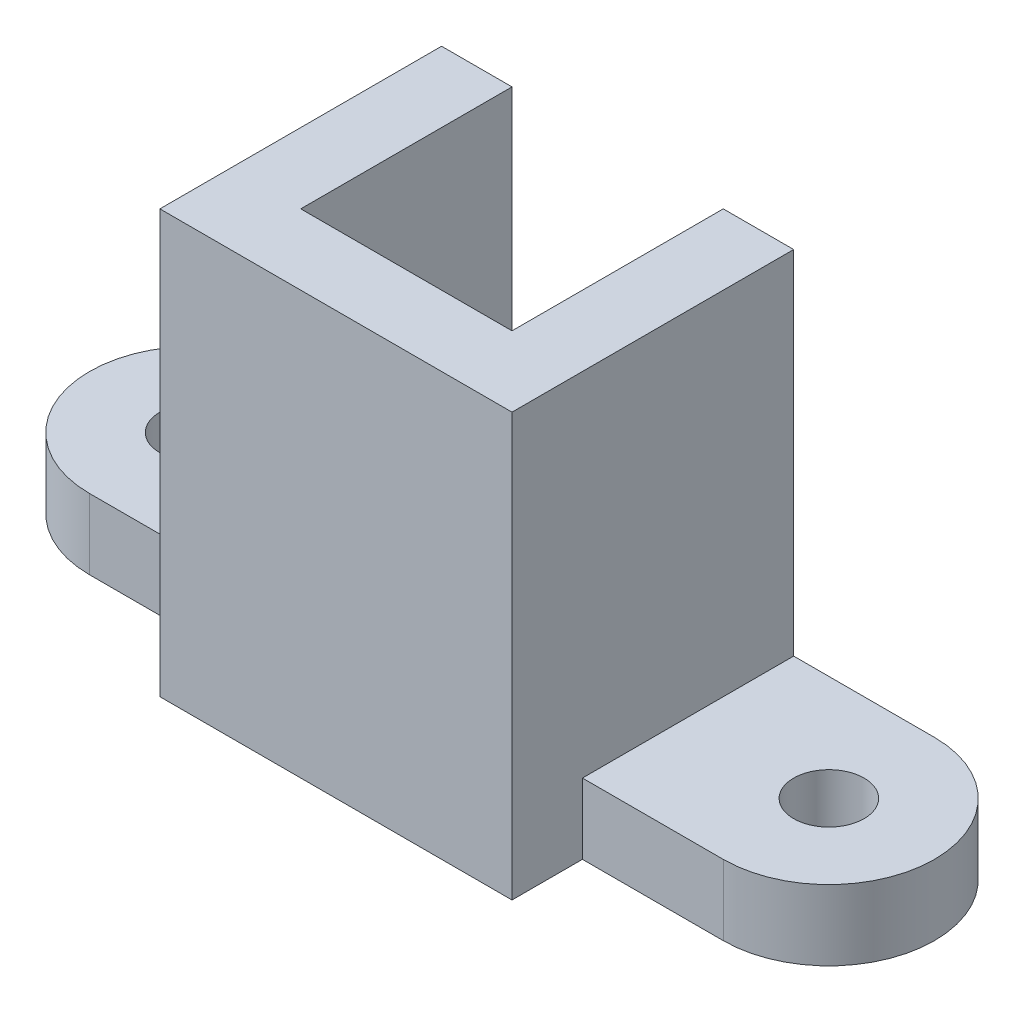
ISO-10303-21;
HEADER;
FILE_DESCRIPTION(('STEP AP214'),'2;1');
FILE_NAME('part.step','',(''),(''),'','','');
FILE_SCHEMA(('AUTOMOTIVE_DESIGN { 1 0 10303 214 1 1 1 1 }'));
ENDSEC;
DATA;
#1=APPLICATION_CONTEXT('core data for automotive mechanical design processes');
#2=APPLICATION_PROTOCOL_DEFINITION('international standard','automotive_design',2000,#1);
#3=PRODUCT_CONTEXT('',#1,'mechanical');
#4=PRODUCT('Part','Part','',(#3));
#5=PRODUCT_RELATED_PRODUCT_CATEGORY('part','',(#4));
#6=PRODUCT_DEFINITION_FORMATION('','',#4);
#7=PRODUCT_DEFINITION_CONTEXT('part definition',#1,'design');
#8=PRODUCT_DEFINITION('design','',#6,#7);
#9=PRODUCT_DEFINITION_SHAPE('','',#8);
#10=(LENGTH_UNIT() NAMED_UNIT(*) SI_UNIT(.MILLI.,.METRE.));
#11=(NAMED_UNIT(*) PLANE_ANGLE_UNIT() SI_UNIT($,.RADIAN.));
#12=(NAMED_UNIT(*) SI_UNIT($,.STERADIAN.) SOLID_ANGLE_UNIT());
#13=UNCERTAINTY_MEASURE_WITH_UNIT(LENGTH_MEASURE(1.E-05),#10,'distance_accuracy_value','');
#14=(GEOMETRIC_REPRESENTATION_CONTEXT(3) GLOBAL_UNCERTAINTY_ASSIGNED_CONTEXT((#13)) GLOBAL_UNIT_ASSIGNED_CONTEXT((#10,
#11,#12)) REPRESENTATION_CONTEXT('',''));
#15=CARTESIAN_POINT('',(0.,0.,0.));
#16=DIRECTION('',(0.,0.,1.));
#17=DIRECTION('',(1.,0.,0.));
#18=AXIS2_PLACEMENT_3D('',#15,#16,#17);
#19=CARTESIAN_POINT('',(60.0000000000005,60.,14.9999999999997));
#20=DIRECTION('',(-1.,0.,0.));
#21=DIRECTION('',(0.,0.,1.));
#22=AXIS2_PLACEMENT_3D('',#19,#20,#21);
#23=PLANE('',#22);
#24=DIRECTION('',(0.,-1.,0.));
#25=VECTOR('',#24,1.);
#26=CARTESIAN_POINT('',(60.0000000000005,60.,-14.9999999999997));
#27=LINE('',#26,#25);
#28=CARTESIAN_POINT('',(60.0000000000005,60.,-14.9999999999997));
#29=VERTEX_POINT('',#28);
#30=CARTESIAN_POINT('',(60.0000000000005,10.,-14.9999999999997));
#31=VERTEX_POINT('',#30);
#32=EDGE_CURVE('E144',#29,#31,#27,.T.);
#33=ORIENTED_EDGE('',*,*,#32,.T.);
#34=DIRECTION('',(0.,-0.857492925712548,-0.51449575542752));
#35=VECTOR('',#34,1.);
#36=CARTESIAN_POINT('',(60.0000000000005,10.,-14.9999999999997));
#37=LINE('',#36,#35);
#38=CARTESIAN_POINT('',(60.0000000000005,60.,14.9999999999997));
#39=VERTEX_POINT('',#38);
#40=EDGE_CURVE('E143',#39,#31,#37,.T.);
#41=ORIENTED_EDGE('',*,*,#40,.F.);
#42=DIRECTION('',(0.,0.,-1.));
#43=VECTOR('',#42,1.);
#44=CARTESIAN_POINT('',(60.0000000000005,60.,14.9999999999997));
#45=LINE('',#44,#43);
#46=EDGE_CURVE('E129',#39,#29,#45,.T.);
#47=ORIENTED_EDGE('',*,*,#46,.T.);
#48=EDGE_LOOP('',(#33,#41,#47));
#49=FACE_BOUND('',#48,.T.);
#50=ADVANCED_FACE('F33',(#49),#23,.T.);
#51=CARTESIAN_POINT('',(30.0000000000005,60.,14.9999999999997));
#52=DIRECTION('',(1.,0.,0.));
#53=DIRECTION('',(0.,0.,-1.));
#54=AXIS2_PLACEMENT_3D('',#51,#52,#53);
#55=PLANE('',#54);
#56=DIRECTION('',(0.,0.,1.));
#57=VECTOR('',#56,1.);
#58=CARTESIAN_POINT('',(30.0000000000005,60.,14.9999999999997));
#59=LINE('',#58,#57);
#60=CARTESIAN_POINT('',(30.0000000000005,60.,-14.9999999999997));
#61=VERTEX_POINT('',#60);
#62=CARTESIAN_POINT('',(30.0000000000005,60.,14.9999999999997));
#63=VERTEX_POINT('',#62);
#64=EDGE_CURVE('E149',#61,#63,#59,.T.);
#65=ORIENTED_EDGE('',*,*,#64,.T.);
#66=DIRECTION('',(0.,-0.857492925712548,-0.51449575542752));
#67=VECTOR('',#66,1.);
#68=CARTESIAN_POINT('',(30.0000000000005,10.,-14.9999999999997));
#69=LINE('',#68,#67);
#70=CARTESIAN_POINT('',(30.0000000000005,10.,-14.9999999999997));
#71=VERTEX_POINT('',#70);
#72=EDGE_CURVE('E56',#63,#71,#69,.T.);
#73=ORIENTED_EDGE('',*,*,#72,.T.);
#74=DIRECTION('',(0.,-1.,0.));
#75=VECTOR('',#74,1.);
#76=CARTESIAN_POINT('',(30.0000000000005,60.,-14.9999999999997));
#77=LINE('',#76,#75);
#78=EDGE_CURVE('E165',#61,#71,#77,.T.);
#79=ORIENTED_EDGE('',*,*,#78,.F.);
#80=EDGE_LOOP('',(#65,#73,#79));
#81=FACE_BOUND('',#80,.T.);
#82=ADVANCED_FACE('F297',(#81),#55,.T.);
#83=CARTESIAN_POINT('',(90.0000000000003,10.,0.));
#84=DIRECTION('',(0.,1.,0.));
#85=DIRECTION('',(0.,0.,1.));
#86=AXIS2_PLACEMENT_3D('',#83,#84,#85);
#87=PLANE('',#86);
#88=DIRECTION('',(0.,0.,-1.));
#89=VECTOR('',#88,1.);
#90=CARTESIAN_POINT('',(70.0000000000005,10.,0.));
#91=LINE('',#90,#89);
#92=CARTESIAN_POINT('',(70.0000000000005,10.,14.9999999999997));
#93=VERTEX_POINT('',#92);
#94=CARTESIAN_POINT('',(70.0000000000005,10.,-14.9999999999997));
#95=VERTEX_POINT('',#94);
#96=EDGE_CURVE('E163',#93,#95,#91,.T.);
#97=ORIENTED_EDGE('',*,*,#96,.F.);
#98=DIRECTION('',(1.,0.,0.));
#99=VECTOR('',#98,1.);
#100=CARTESIAN_POINT('',(70.0000000000005,10.,14.9999999999997));
#101=LINE('',#100,#99);
#102=CARTESIAN_POINT('',(90.0000000000003,10.,14.9999999999997));
#103=VERTEX_POINT('',#102);
#104=EDGE_CURVE('E197',#93,#103,#101,.T.);
#105=ORIENTED_EDGE('',*,*,#104,.T.);
#106=CARTESIAN_POINT('',(90.0000000000003,10.,0.));
#107=DIRECTION('',(0.,1.,0.));
#108=DIRECTION('',(0.,0.,1.));
#109=AXIS2_PLACEMENT_3D('',#106,#107,#108);
#110=CIRCLE('',#109,14.9999999999997);
#111=CARTESIAN_POINT('',(90.0000000000003,10.,-14.9999999999997));
#112=VERTEX_POINT('',#111);
#113=EDGE_CURVE('E185',#103,#112,#110,.T.);
#114=ORIENTED_EDGE('',*,*,#113,.T.);
#115=DIRECTION('',(-1.,0.,0.));
#116=VECTOR('',#115,1.);
#117=CARTESIAN_POINT('',(90.0000000000003,10.,-14.9999999999997));
#118=LINE('',#117,#116);
#119=EDGE_CURVE('E190',#112,#95,#118,.T.);
#120=ORIENTED_EDGE('',*,*,#119,.T.);
#121=EDGE_LOOP('',(#97,#105,#114,#120));
#122=FACE_BOUND('',#121,.T.);
#123=CARTESIAN_POINT('',(90.0000000000003,10.,0.));
#124=DIRECTION('',(0.,1.,0.));
#125=DIRECTION('',(0.,0.,1.));
#126=AXIS2_PLACEMENT_3D('',#123,#124,#125);
#127=CIRCLE('',#126,4.99999999999983);
#128=CARTESIAN_POINT('',(90.0000000000003,10.,4.99999999999983));
#129=VERTEX_POINT('',#128);
#130=EDGE_CURVE('E173',#129,#129,#127,.T.);
#131=ORIENTED_EDGE('',*,*,#130,.F.);
#132=EDGE_LOOP('',(#131));
#133=FACE_BOUND('',#132,.T.);
#134=ADVANCED_FACE('F272',(#122,#133),#87,.T.);
#135=DIRECTION('',(0.,0.,1.));
#136=VECTOR('',#135,1.);
#137=CARTESIAN_POINT('',(20.0000000000005,10.,0.));
#138=LINE('',#137,#136);
#139=CARTESIAN_POINT('',(20.0000000000005,10.,-14.9999999999997));
#140=VERTEX_POINT('',#139);
#141=CARTESIAN_POINT('',(20.0000000000005,10.,14.9999999999997));
#142=VERTEX_POINT('',#141);
#143=EDGE_CURVE('E48',#140,#142,#138,.T.);
#144=ORIENTED_EDGE('',*,*,#143,.F.);
#145=CARTESIAN_POINT('',(0.,10.,-14.9999999999997));
#146=VERTEX_POINT('',#145);
#147=EDGE_CURVE('E188',#140,#146,#118,.T.);
#148=ORIENTED_EDGE('',*,*,#147,.T.);
#149=CARTESIAN_POINT('',(0.,10.,0.));
#150=DIRECTION('',(0.,1.,0.));
#151=DIRECTION('',(0.,0.,1.));
#152=AXIS2_PLACEMENT_3D('',#149,#150,#151);
#153=CIRCLE('',#152,14.9999999999997);
#154=CARTESIAN_POINT('',(0.,10.,14.9999999999997));
#155=VERTEX_POINT('',#154);
#156=EDGE_CURVE('E192',#146,#155,#153,.T.);
#157=ORIENTED_EDGE('',*,*,#156,.T.);
#158=DIRECTION('',(1.,0.,0.));
#159=VECTOR('',#158,1.);
#160=CARTESIAN_POINT('',(0.,10.,14.9999999999997));
#161=LINE('',#160,#159);
#162=EDGE_CURVE('E195',#155,#142,#161,.T.);
#163=ORIENTED_EDGE('',*,*,#162,.T.);
#164=EDGE_LOOP('',(#144,#148,#157,#163));
#165=FACE_BOUND('',#164,.T.);
#166=CARTESIAN_POINT('',(0.,10.,0.));
#167=DIRECTION('',(0.,1.,0.));
#168=DIRECTION('',(0.,0.,1.));
#169=AXIS2_PLACEMENT_3D('',#166,#167,#168);
#170=CIRCLE('',#169,5.);
#171=CARTESIAN_POINT('',(0.,10.,5.));
#172=VERTEX_POINT('',#171);
#173=EDGE_CURVE('E179',#172,#172,#170,.T.);
#174=ORIENTED_EDGE('',*,*,#173,.F.);
#175=EDGE_LOOP('',(#174));
#176=FACE_BOUND('',#175,.T.);
#177=ADVANCED_FACE('F269',(#165,#176),#87,.T.);
#178=CARTESIAN_POINT('',(90.0000000000003,0.,0.));
#179=DIRECTION('',(0.,1.,0.));
#180=DIRECTION('',(0.,0.,1.));
#181=AXIS2_PLACEMENT_3D('',#178,#179,#180);
#182=PLANE('',#181);
#183=CARTESIAN_POINT('',(0.,0.,0.));
#184=DIRECTION('',(0.,1.,0.));
#185=DIRECTION('',(0.,0.,1.));
#186=AXIS2_PLACEMENT_3D('',#183,#184,#185);
#187=CIRCLE('',#186,14.9999999999997);
#188=CARTESIAN_POINT('',(0.,0.,-14.9999999999997));
#189=VERTEX_POINT('',#188);
#190=CARTESIAN_POINT('',(0.,0.,14.9999999999997));
#191=VERTEX_POINT('',#190);
#192=EDGE_CURVE('E204',#189,#191,#187,.T.);
#193=ORIENTED_EDGE('',*,*,#192,.F.);
#194=DIRECTION('',(-1.,0.,0.));
#195=VECTOR('',#194,1.);
#196=CARTESIAN_POINT('',(90.0000000000003,0.,-14.9999999999997));
#197=LINE('',#196,#195);
#198=CARTESIAN_POINT('',(90.0000000000003,0.,-14.9999999999997));
#199=VERTEX_POINT('',#198);
#200=EDGE_CURVE('E202',#199,#189,#197,.T.);
#201=ORIENTED_EDGE('',*,*,#200,.F.);
#202=CARTESIAN_POINT('',(90.0000000000003,0.,0.));
#203=DIRECTION('',(0.,1.,0.));
#204=DIRECTION('',(0.,0.,1.));
#205=AXIS2_PLACEMENT_3D('',#202,#203,#204);
#206=CIRCLE('',#205,14.9999999999997);
#207=CARTESIAN_POINT('',(90.0000000000003,0.,14.9999999999997));
#208=VERTEX_POINT('',#207);
#209=EDGE_CURVE('E182',#208,#199,#206,.T.);
#210=ORIENTED_EDGE('',*,*,#209,.F.);
#211=DIRECTION('',(1.,0.,0.));
#212=VECTOR('',#211,1.);
#213=CARTESIAN_POINT('',(70.0000000000005,0.,14.9999999999997));
#214=LINE('',#213,#212);
#215=CARTESIAN_POINT('',(70.0000000000005,0.,14.9999999999997));
#216=VERTEX_POINT('',#215);
#217=EDGE_CURVE('E189',#216,#208,#214,.T.);
#218=ORIENTED_EDGE('',*,*,#217,.F.);
#219=DIRECTION('',(0.,0.,-1.));
#220=VECTOR('',#219,1.);
#221=CARTESIAN_POINT('',(70.0000000000005,0.,24.9999999999997));
#222=LINE('',#221,#220);
#223=CARTESIAN_POINT('',(70.0000000000005,0.,24.9999999999997));
#224=VERTEX_POINT('',#223);
#225=EDGE_CURVE('E212',#224,#216,#222,.T.);
#226=ORIENTED_EDGE('',*,*,#225,.F.);
#227=DIRECTION('',(1.,0.,0.));
#228=VECTOR('',#227,1.);
#229=CARTESIAN_POINT('',(20.0000000000005,0.,24.9999999999997));
#230=LINE('',#229,#228);
#231=CARTESIAN_POINT('',(20.0000000000005,0.,24.9999999999997));
#232=VERTEX_POINT('',#231);
#233=EDGE_CURVE('E210',#232,#224,#230,.T.);
#234=ORIENTED_EDGE('',*,*,#233,.F.);
#235=DIRECTION('',(0.,0.,1.));
#236=VECTOR('',#235,1.);
#237=CARTESIAN_POINT('',(20.0000000000005,0.,14.9999999999997));
#238=LINE('',#237,#236);
#239=CARTESIAN_POINT('',(20.0000000000005,0.,14.9999999999997));
#240=VERTEX_POINT('',#239);
#241=EDGE_CURVE('E208',#240,#232,#238,.T.);
#242=ORIENTED_EDGE('',*,*,#241,.F.);
#243=DIRECTION('',(1.,0.,0.));
#244=VECTOR('',#243,1.);
#245=CARTESIAN_POINT('',(0.,0.,14.9999999999997));
#246=LINE('',#245,#244);
#247=EDGE_CURVE('E206',#191,#240,#246,.T.);
#248=ORIENTED_EDGE('',*,*,#247,.F.);
#249=EDGE_LOOP('',(#193,#201,#210,#218,#226,#234,#242,#248));
#250=FACE_BOUND('',#249,.T.);
#251=CARTESIAN_POINT('',(0.,0.,0.));
#252=DIRECTION('',(0.,1.,0.));
#253=DIRECTION('',(0.,0.,1.));
#254=AXIS2_PLACEMENT_3D('',#251,#252,#253);
#255=CIRCLE('',#254,5.);
#256=CARTESIAN_POINT('',(0.,0.,5.));
#257=VERTEX_POINT('',#256);
#258=EDGE_CURVE('E176',#257,#257,#255,.T.);
#259=ORIENTED_EDGE('',*,*,#258,.T.);
#260=EDGE_LOOP('',(#259));
#261=FACE_BOUND('',#260,.T.);
#262=CARTESIAN_POINT('',(90.0000000000003,0.,0.));
#263=DIRECTION('',(0.,1.,0.));
#264=DIRECTION('',(0.,0.,1.));
#265=AXIS2_PLACEMENT_3D('',#262,#263,#264);
#266=CIRCLE('',#265,4.99999999999983);
#267=CARTESIAN_POINT('',(90.0000000000003,0.,4.99999999999983));
#268=VERTEX_POINT('',#267);
#269=EDGE_CURVE('E172',#268,#268,#266,.T.);
#270=ORIENTED_EDGE('',*,*,#269,.T.);
#271=EDGE_LOOP('',(#270));
#272=FACE_BOUND('',#271,.T.);
#273=ADVANCED_FACE('F241',(#250,#261,#272),#182,.F.);
#274=CARTESIAN_POINT('',(90.0000000000003,10.,0.));
#275=DIRECTION('',(0.,-1.,0.));
#276=DIRECTION('',(0.,0.,-1.));
#277=AXIS2_PLACEMENT_3D('',#274,#275,#276);
#278=CYLINDRICAL_SURFACE('',#277,14.9999999999997);
#279=ORIENTED_EDGE('',*,*,#209,.T.);
#280=DIRECTION('',(0.,-1.,0.));
#281=VECTOR('',#280,1.);
#282=CARTESIAN_POINT('',(90.0000000000003,10.,-14.9999999999997));
#283=LINE('',#282,#281);
#284=EDGE_CURVE('E11',#112,#199,#283,.T.);
#285=ORIENTED_EDGE('',*,*,#284,.F.);
#286=ORIENTED_EDGE('',*,*,#113,.F.);
#287=DIRECTION('',(0.,-1.,0.));
#288=VECTOR('',#287,1.);
#289=CARTESIAN_POINT('',(90.0000000000003,10.,14.9999999999997));
#290=LINE('',#289,#288);
#291=EDGE_CURVE('E199',#103,#208,#290,.T.);
#292=ORIENTED_EDGE('',*,*,#291,.T.);
#293=EDGE_LOOP('',(#279,#285,#286,#292));
#294=FACE_BOUND('',#293,.T.);
#295=ADVANCED_FACE('F35',(#294),#278,.T.);
#296=CARTESIAN_POINT('',(90.0000000000003,10.,-14.9999999999997));
#297=DIRECTION('',(0.,0.,1.));
#298=DIRECTION('',(1.,0.,0.));
#299=AXIS2_PLACEMENT_3D('',#296,#297,#298);
#300=PLANE('',#299);
#301=ORIENTED_EDGE('',*,*,#147,.F.);
#302=DIRECTION('',(0.,-1.,0.));
#303=VECTOR('',#302,1.);
#304=CARTESIAN_POINT('',(20.0000000000005,60.,-14.9999999999997));
#305=LINE('',#304,#303);
#306=CARTESIAN_POINT('',(20.0000000000005,60.,-14.9999999999997));
#307=VERTEX_POINT('',#306);
#308=EDGE_CURVE('E159',#307,#140,#305,.T.);
#309=ORIENTED_EDGE('',*,*,#308,.F.);
#310=DIRECTION('',(1.,0.,0.));
#311=VECTOR('',#310,1.);
#312=CARTESIAN_POINT('',(20.0000000000005,60.,-14.9999999999997));
#313=LINE('',#312,#311);
#314=EDGE_CURVE('E151',#307,#61,#313,.T.);
#315=ORIENTED_EDGE('',*,*,#314,.T.);
#316=ORIENTED_EDGE('',*,*,#78,.T.);
#317=EDGE_CURVE('E193',#31,#71,#118,.T.);
#318=ORIENTED_EDGE('',*,*,#317,.F.);
#319=ORIENTED_EDGE('',*,*,#32,.F.);
#320=DIRECTION('',(1.,0.,0.));
#321=VECTOR('',#320,1.);
#322=CARTESIAN_POINT('',(70.0000000000005,60.,-14.9999999999997));
#323=LINE('',#322,#321);
#324=CARTESIAN_POINT('',(70.0000000000005,60.,-14.9999999999997));
#325=VERTEX_POINT('',#324);
#326=EDGE_CURVE('E138',#29,#325,#323,.T.);
#327=ORIENTED_EDGE('',*,*,#326,.T.);
#328=DIRECTION('',(0.,-1.,0.));
#329=VECTOR('',#328,1.);
#330=CARTESIAN_POINT('',(70.0000000000005,60.,-14.9999999999997));
#331=LINE('',#330,#329);
#332=EDGE_CURVE('E160',#325,#95,#331,.T.);
#333=ORIENTED_EDGE('',*,*,#332,.T.);
#334=ORIENTED_EDGE('',*,*,#119,.F.);
#335=ORIENTED_EDGE('',*,*,#284,.T.);
#336=ORIENTED_EDGE('',*,*,#200,.T.);
#337=DIRECTION('',(0.,-1.,0.));
#338=VECTOR('',#337,1.);
#339=CARTESIAN_POINT('',(0.,10.,-14.9999999999997));
#340=LINE('',#339,#338);
#341=EDGE_CURVE('E41',#146,#189,#340,.T.);
#342=ORIENTED_EDGE('',*,*,#341,.F.);
#343=EDGE_LOOP('',(#301,#309,#315,#316,#318,#319,#327,#333,#334,#335,#336,#342));
#344=FACE_BOUND('',#343,.T.);
#345=ADVANCED_FACE('F257',(#344),#300,.F.);
#346=CARTESIAN_POINT('',(0.,10.,0.));
#347=DIRECTION('',(0.,-1.,0.));
#348=DIRECTION('',(0.,0.,-1.));
#349=AXIS2_PLACEMENT_3D('',#346,#347,#348);
#350=CYLINDRICAL_SURFACE('',#349,14.9999999999997);
#351=ORIENTED_EDGE('',*,*,#192,.T.);
#352=DIRECTION('',(0.,-1.,0.));
#353=VECTOR('',#352,1.);
#354=CARTESIAN_POINT('',(0.,10.,14.9999999999997));
#355=LINE('',#354,#353);
#356=EDGE_CURVE('E229',#155,#191,#355,.T.);
#357=ORIENTED_EDGE('',*,*,#356,.F.);
#358=ORIENTED_EDGE('',*,*,#156,.F.);
#359=ORIENTED_EDGE('',*,*,#341,.T.);
#360=EDGE_LOOP('',(#351,#357,#358,#359));
#361=FACE_BOUND('',#360,.T.);
#362=ADVANCED_FACE('F236',(#361),#350,.T.);
#363=CARTESIAN_POINT('',(0.,10.,14.9999999999997));
#364=DIRECTION('',(0.,0.,-1.));
#365=DIRECTION('',(-1.,0.,0.));
#366=AXIS2_PLACEMENT_3D('',#363,#364,#365);
#367=PLANE('',#366);
#368=ORIENTED_EDGE('',*,*,#247,.T.);
#369=DIRECTION('',(0.,-1.,0.));
#370=VECTOR('',#369,1.);
#371=CARTESIAN_POINT('',(20.0000000000005,10.,14.9999999999997));
#372=LINE('',#371,#370);
#373=EDGE_CURVE('E226',#142,#240,#372,.T.);
#374=ORIENTED_EDGE('',*,*,#373,.F.);
#375=ORIENTED_EDGE('',*,*,#162,.F.);
#376=ORIENTED_EDGE('',*,*,#356,.T.);
#377=EDGE_LOOP('',(#368,#374,#375,#376));
#378=FACE_BOUND('',#377,.T.);
#379=ADVANCED_FACE('F248',(#378),#367,.F.);
#380=CARTESIAN_POINT('',(20.0000000000005,10.,14.9999999999997));
#381=DIRECTION('',(1.,0.,0.));
#382=DIRECTION('',(0.,0.,-1.));
#383=AXIS2_PLACEMENT_3D('',#380,#381,#382);
#384=PLANE('',#383);
#385=ORIENTED_EDGE('',*,*,#241,.T.);
#386=DIRECTION('',(0.,-1.,0.));
#387=VECTOR('',#386,1.);
#388=CARTESIAN_POINT('',(20.0000000000005,10.,24.9999999999997));
#389=LINE('',#388,#387);
#390=CARTESIAN_POINT('',(20.0000000000005,60.,24.9999999999997));
#391=VERTEX_POINT('',#390);
#392=EDGE_CURVE('E223',#391,#232,#389,.T.);
#393=ORIENTED_EDGE('',*,*,#392,.F.);
#394=DIRECTION('',(0.,0.,-1.));
#395=VECTOR('',#394,1.);
#396=CARTESIAN_POINT('',(20.0000000000005,60.,24.9999999999997));
#397=LINE('',#396,#395);
#398=EDGE_CURVE('E254',#391,#307,#397,.T.);
#399=ORIENTED_EDGE('',*,*,#398,.T.);
#400=ORIENTED_EDGE('',*,*,#308,.T.);
#401=ORIENTED_EDGE('',*,*,#143,.T.);
#402=ORIENTED_EDGE('',*,*,#373,.T.);
#403=EDGE_LOOP('',(#385,#393,#399,#400,#401,#402));
#404=FACE_BOUND('',#403,.T.);
#405=ADVANCED_FACE('F251',(#404),#384,.F.);
#406=CARTESIAN_POINT('',(20.0000000000005,10.,24.9999999999997));
#407=DIRECTION('',(0.,0.,-1.));
#408=DIRECTION('',(-1.,0.,0.));
#409=AXIS2_PLACEMENT_3D('',#406,#407,#408);
#410=PLANE('',#409);
#411=ORIENTED_EDGE('',*,*,#233,.T.);
#412=DIRECTION('',(0.,-1.,0.));
#413=VECTOR('',#412,1.);
#414=CARTESIAN_POINT('',(70.0000000000005,10.,24.9999999999997));
#415=LINE('',#414,#413);
#416=CARTESIAN_POINT('',(70.0000000000005,60.,24.9999999999997));
#417=VERTEX_POINT('',#416);
#418=EDGE_CURVE('E220',#417,#224,#415,.T.);
#419=ORIENTED_EDGE('',*,*,#418,.F.);
#420=DIRECTION('',(-1.,0.,0.));
#421=VECTOR('',#420,1.);
#422=CARTESIAN_POINT('',(70.0000000000005,60.,24.9999999999997));
#423=LINE('',#422,#421);
#424=EDGE_CURVE('E259',#417,#391,#423,.T.);
#425=ORIENTED_EDGE('',*,*,#424,.T.);
#426=ORIENTED_EDGE('',*,*,#392,.T.);
#427=EDGE_LOOP('',(#411,#419,#425,#426));
#428=FACE_BOUND('',#427,.T.);
#429=ADVANCED_FACE('F264',(#428),#410,.F.);
#430=CARTESIAN_POINT('',(70.0000000000005,10.,24.9999999999997));
#431=DIRECTION('',(-1.,0.,0.));
#432=DIRECTION('',(0.,0.,1.));
#433=AXIS2_PLACEMENT_3D('',#430,#431,#432);
#434=PLANE('',#433);
#435=ORIENTED_EDGE('',*,*,#225,.T.);
#436=DIRECTION('',(0.,-1.,0.));
#437=VECTOR('',#436,1.);
#438=CARTESIAN_POINT('',(70.0000000000005,10.,14.9999999999997));
#439=LINE('',#438,#437);
#440=EDGE_CURVE('E217',#93,#216,#439,.T.);
#441=ORIENTED_EDGE('',*,*,#440,.F.);
#442=ORIENTED_EDGE('',*,*,#96,.T.);
#443=ORIENTED_EDGE('',*,*,#332,.F.);
#444=DIRECTION('',(0.,0.,1.));
#445=VECTOR('',#444,1.);
#446=CARTESIAN_POINT('',(70.0000000000005,60.,24.9999999999997));
#447=LINE('',#446,#445);
#448=EDGE_CURVE('E156',#325,#417,#447,.T.);
#449=ORIENTED_EDGE('',*,*,#448,.T.);
#450=ORIENTED_EDGE('',*,*,#418,.T.);
#451=EDGE_LOOP('',(#435,#441,#442,#443,#449,#450));
#452=FACE_BOUND('',#451,.T.);
#453=ADVANCED_FACE('F266',(#452),#434,.F.);
#454=CARTESIAN_POINT('',(70.0000000000005,10.,14.9999999999997));
#455=DIRECTION('',(0.,0.,-1.));
#456=DIRECTION('',(-1.,0.,0.));
#457=AXIS2_PLACEMENT_3D('',#454,#455,#456);
#458=PLANE('',#457);
#459=ORIENTED_EDGE('',*,*,#217,.T.);
#460=ORIENTED_EDGE('',*,*,#291,.F.);
#461=ORIENTED_EDGE('',*,*,#104,.F.);
#462=ORIENTED_EDGE('',*,*,#440,.T.);
#463=EDGE_LOOP('',(#459,#460,#461,#462));
#464=FACE_BOUND('',#463,.T.);
#465=ADVANCED_FACE('F280',(#464),#458,.F.);
#466=CARTESIAN_POINT('',(0.,10.,0.));
#467=DIRECTION('',(0.,-1.,0.));
#468=DIRECTION('',(0.,0.,-1.));
#469=AXIS2_PLACEMENT_3D('',#466,#467,#468);
#470=CYLINDRICAL_SURFACE('',#469,5.);
#471=ORIENTED_EDGE('',*,*,#173,.T.);
#472=EDGE_LOOP('',(#471));
#473=FACE_BOUND('',#472,.T.);
#474=ORIENTED_EDGE('',*,*,#258,.F.);
#475=EDGE_LOOP('',(#474));
#476=FACE_BOUND('',#475,.T.);
#477=ADVANCED_FACE('F276',(#473,#476),#470,.F.);
#478=CARTESIAN_POINT('',(90.0000000000003,10.,0.));
#479=DIRECTION('',(0.,-1.,0.));
#480=DIRECTION('',(0.,0.,-1.));
#481=AXIS2_PLACEMENT_3D('',#478,#479,#480);
#482=CYLINDRICAL_SURFACE('',#481,4.99999999999983);
#483=ORIENTED_EDGE('',*,*,#130,.T.);
#484=EDGE_LOOP('',(#483));
#485=FACE_BOUND('',#484,.T.);
#486=ORIENTED_EDGE('',*,*,#269,.F.);
#487=EDGE_LOOP('',(#486));
#488=FACE_BOUND('',#487,.T.);
#489=ADVANCED_FACE('F279',(#485,#488),#482,.F.);
#490=CARTESIAN_POINT('',(0.,60.,0.));
#491=DIRECTION('',(0.,-1.,0.));
#492=DIRECTION('',(0.,0.,-1.));
#493=AXIS2_PLACEMENT_3D('',#490,#491,#492);
#494=PLANE('',#493);
#495=ORIENTED_EDGE('',*,*,#424,.F.);
#496=ORIENTED_EDGE('',*,*,#448,.F.);
#497=ORIENTED_EDGE('',*,*,#326,.F.);
#498=ORIENTED_EDGE('',*,*,#46,.F.);
#499=DIRECTION('',(1.,0.,0.));
#500=VECTOR('',#499,1.);
#501=CARTESIAN_POINT('',(30.0000000000005,60.,14.9999999999997));
#502=LINE('',#501,#500);
#503=EDGE_CURVE('E135',#63,#39,#502,.T.);
#504=ORIENTED_EDGE('',*,*,#503,.F.);
#505=ORIENTED_EDGE('',*,*,#64,.F.);
#506=ORIENTED_EDGE('',*,*,#314,.F.);
#507=ORIENTED_EDGE('',*,*,#398,.F.);
#508=EDGE_LOOP('',(#495,#496,#497,#498,#504,#505,#506,#507));
#509=FACE_BOUND('',#508,.T.);
#510=ADVANCED_FACE('F132',(#509),#494,.F.);
#511=CARTESIAN_POINT('',(30.0000000000005,10.,-14.9999999999997));
#512=DIRECTION('',(0.,-0.51449575542752,0.857492925712548));
#513=DIRECTION('',(0.,-0.857492925712548,-0.51449575542752));
#514=AXIS2_PLACEMENT_3D('',#511,#512,#513);
#515=PLANE('',#514);
#516=ORIENTED_EDGE('',*,*,#40,.T.);
#517=ORIENTED_EDGE('',*,*,#317,.T.);
#518=ORIENTED_EDGE('',*,*,#72,.F.);
#519=ORIENTED_EDGE('',*,*,#503,.T.);
#520=EDGE_LOOP('',(#516,#517,#518,#519));
#521=FACE_BOUND('',#520,.T.);
#522=ADVANCED_FACE('F148',(#521),#515,.F.);
#523=CLOSED_SHELL('',(#50,#82,#134,#177,#273,#295,#345,#362,#379,#405,#429,#453,#465,#477,#489,
#510,#522));
#524=MANIFOLD_SOLID_BREP('B2',#523);
#525=ADVANCED_BREP_SHAPE_REPRESENTATION('',(#18,#524),#14);
#526=SHAPE_DEFINITION_REPRESENTATION(#9,#525);
ENDSEC;
END-ISO-10303-21;
